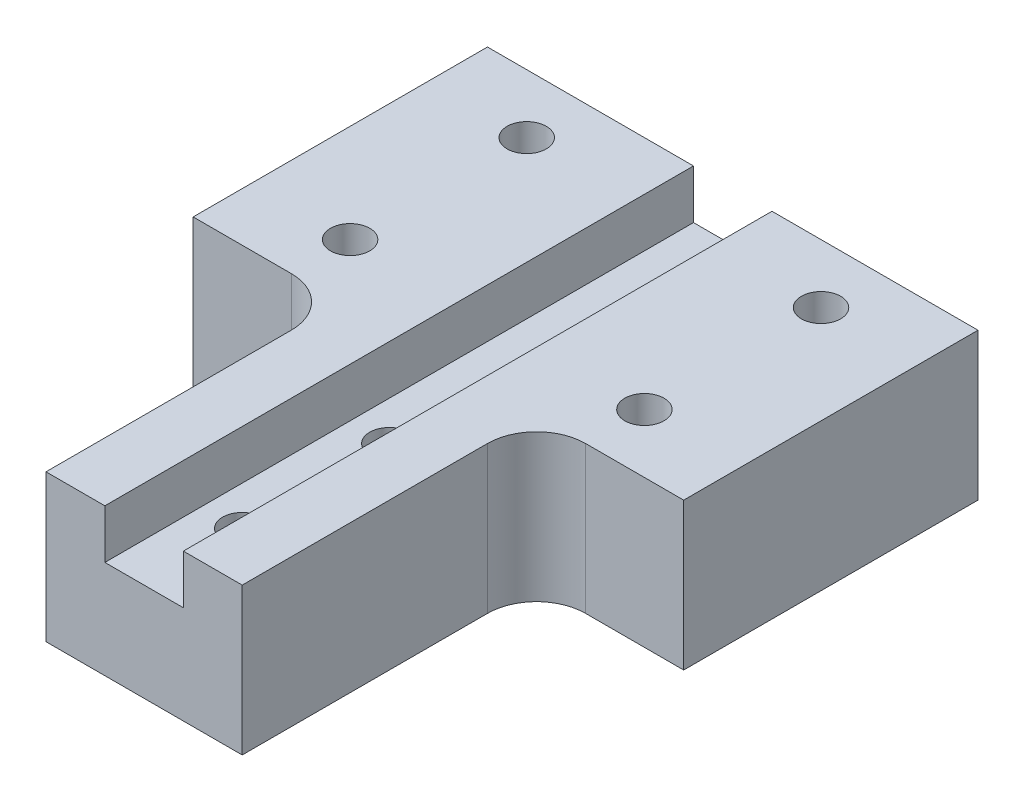
ISO-10303-21;
HEADER;
FILE_DESCRIPTION(('STEP AP214'),'2;1');
FILE_NAME('part.step','',(''),(''),'','','');
FILE_SCHEMA(('AUTOMOTIVE_DESIGN { 1 0 10303 214 1 1 1 1 }'));
ENDSEC;
DATA;
#1=APPLICATION_CONTEXT('core data for automotive mechanical design processes');
#2=APPLICATION_PROTOCOL_DEFINITION('international standard','automotive_design',2000,#1);
#3=PRODUCT_CONTEXT('',#1,'mechanical');
#4=PRODUCT('Part','Part','',(#3));
#5=PRODUCT_RELATED_PRODUCT_CATEGORY('part','',(#4));
#6=PRODUCT_DEFINITION_FORMATION('','',#4);
#7=PRODUCT_DEFINITION_CONTEXT('part definition',#1,'design');
#8=PRODUCT_DEFINITION('design','',#6,#7);
#9=PRODUCT_DEFINITION_SHAPE('','',#8);
#10=(LENGTH_UNIT() NAMED_UNIT(*) SI_UNIT(.MILLI.,.METRE.));
#11=(NAMED_UNIT(*) PLANE_ANGLE_UNIT() SI_UNIT($,.RADIAN.));
#12=(NAMED_UNIT(*) SI_UNIT($,.STERADIAN.) SOLID_ANGLE_UNIT());
#13=UNCERTAINTY_MEASURE_WITH_UNIT(LENGTH_MEASURE(1.E-05),#10,'distance_accuracy_value','');
#14=(GEOMETRIC_REPRESENTATION_CONTEXT(3) GLOBAL_UNCERTAINTY_ASSIGNED_CONTEXT((#13)) GLOBAL_UNIT_ASSIGNED_CONTEXT((#10,
#11,#12)) REPRESENTATION_CONTEXT('',''));
#15=CARTESIAN_POINT('',(0.,0.,0.));
#16=DIRECTION('',(0.,0.,1.));
#17=DIRECTION('',(1.,0.,0.));
#18=AXIS2_PLACEMENT_3D('',#15,#16,#17);
#19=CARTESIAN_POINT('',(0.,0.,0.));
#20=DIRECTION('',(0.,1.,0.));
#21=DIRECTION('',(0.,0.,1.));
#22=AXIS2_PLACEMENT_3D('',#19,#20,#21);
#23=PLANE('',#22);
#24=DIRECTION('',(0.,0.,-1.));
#25=VECTOR('',#24,1.);
#26=CARTESIAN_POINT('',(3.99999999999999,0.,-21.8624338624339));
#27=LINE('',#26,#25);
#28=CARTESIAN_POINT('',(4.00000000000001,0.,45.));
#29=VERTEX_POINT('',#28);
#30=CARTESIAN_POINT('',(4.,0.,-15.));
#31=VERTEX_POINT('',#30);
#32=EDGE_CURVE('E144',#29,#31,#27,.T.);
#33=ORIENTED_EDGE('',*,*,#32,.F.);
#34=DIRECTION('',(1.,0.,0.));
#35=VECTOR('',#34,1.);
#36=CARTESIAN_POINT('',(0.,0.,45.));
#37=LINE('',#36,#35);
#38=CARTESIAN_POINT('',(10.,0.,45.));
#39=VERTEX_POINT('',#38);
#40=EDGE_CURVE('E155',#29,#39,#37,.T.);
#41=ORIENTED_EDGE('',*,*,#40,.T.);
#42=DIRECTION('',(0.,0.,1.));
#43=VECTOR('',#42,1.);
#44=CARTESIAN_POINT('',(10.,0.,0.));
#45=LINE('',#44,#43);
#46=CARTESIAN_POINT('',(10.,0.,20.));
#47=VERTEX_POINT('',#46);
#48=EDGE_CURVE('E171',#47,#39,#45,.T.);
#49=ORIENTED_EDGE('',*,*,#48,.F.);
#50=CARTESIAN_POINT('',(15.,0.,20.));
#51=DIRECTION('',(0.,1.,0.));
#52=DIRECTION('',(0.,0.,1.));
#53=AXIS2_PLACEMENT_3D('',#50,#51,#52);
#54=CIRCLE('',#53,5.);
#55=CARTESIAN_POINT('',(15.,0.,15.));
#56=VERTEX_POINT('',#55);
#57=EDGE_CURVE('E248',#47,#56,#54,.F.);
#58=ORIENTED_EDGE('',*,*,#57,.T.);
#59=DIRECTION('',(1.,0.,0.));
#60=VECTOR('',#59,1.);
#61=CARTESIAN_POINT('',(0.,0.,15.));
#62=LINE('',#61,#60);
#63=CARTESIAN_POINT('',(25.,0.,15.));
#64=VERTEX_POINT('',#63);
#65=EDGE_CURVE('E227',#56,#64,#62,.T.);
#66=ORIENTED_EDGE('',*,*,#65,.T.);
#67=DIRECTION('',(0.,0.,1.));
#68=VECTOR('',#67,1.);
#69=CARTESIAN_POINT('',(25.,0.,0.));
#70=LINE('',#69,#68);
#71=CARTESIAN_POINT('',(25.,0.,-15.));
#72=VERTEX_POINT('',#71);
#73=EDGE_CURVE('E218',#72,#64,#70,.T.);
#74=ORIENTED_EDGE('',*,*,#73,.F.);
#75=DIRECTION('',(1.,0.,0.));
#76=VECTOR('',#75,1.);
#77=CARTESIAN_POINT('',(0.,0.,-15.));
#78=LINE('',#77,#76);
#79=EDGE_CURVE('E158',#31,#72,#78,.T.);
#80=ORIENTED_EDGE('',*,*,#79,.F.);
#81=EDGE_LOOP('',(#33,#41,#49,#58,#66,#74,#80));
#82=FACE_BOUND('',#81,.T.);
#83=CARTESIAN_POINT('',(15.,0.,9.));
#84=DIRECTION('',(0.,1.,0.));
#85=DIRECTION('',(0.,0.,1.));
#86=AXIS2_PLACEMENT_3D('',#83,#84,#85);
#87=CIRCLE('',#86,2.00000000000001);
#88=CARTESIAN_POINT('',(15.,0.,11.));
#89=VERTEX_POINT('',#88);
#90=EDGE_CURVE('E212',#89,#89,#87,.T.);
#91=ORIENTED_EDGE('',*,*,#90,.F.);
#92=EDGE_LOOP('',(#91));
#93=FACE_BOUND('',#92,.T.);
#94=CARTESIAN_POINT('',(15.,0.,-9.));
#95=DIRECTION('',(0.,1.,0.));
#96=DIRECTION('',(0.,0.,1.));
#97=AXIS2_PLACEMENT_3D('',#94,#95,#96);
#98=CIRCLE('',#97,2.00000000000001);
#99=CARTESIAN_POINT('',(15.,0.,-6.99999999999999));
#100=VERTEX_POINT('',#99);
#101=EDGE_CURVE('E205',#100,#100,#98,.T.);
#102=ORIENTED_EDGE('',*,*,#101,.F.);
#103=EDGE_LOOP('',(#102));
#104=FACE_BOUND('',#103,.T.);
#105=ADVANCED_FACE('F42',(#82,#93,#104),#23,.T.);
#106=CARTESIAN_POINT('',(0.,-51.0555127546399,20.));
#107=DIRECTION('',(0.,1.,0.));
#108=DIRECTION('',(0.,0.,1.));
#109=AXIS2_PLACEMENT_3D('',#106,#107,#108);
#110=CYLINDRICAL_SURFACE('',#109,2.);
#111=CARTESIAN_POINT('',(0.,-15.,20.));
#112=DIRECTION('',(0.,1.,0.));
#113=DIRECTION('',(0.,0.,1.));
#114=AXIS2_PLACEMENT_3D('',#111,#112,#113);
#115=CIRCLE('',#114,2.);
#116=CARTESIAN_POINT('',(0.,-15.,22.));
#117=VERTEX_POINT('',#116);
#118=EDGE_CURVE('E209',#117,#117,#115,.F.);
#119=CARTESIAN_POINT('',(0.,-5.,20.));
#120=DIRECTION('',(0.,1.,0.));
#121=DIRECTION('',(0.,0.,1.));
#122=AXIS2_PLACEMENT_3D('',#119,#120,#121);
#123=CIRCLE('',#122,2.);
#124=CARTESIAN_POINT('',(0.,-5.,22.));
#125=VERTEX_POINT('',#124);
#126=EDGE_CURVE('E270',#125,#125,#123,.F.);
#127=CARTESIAN_POINT('',(0.,-15.,22.));
#128=CARTESIAN_POINT('',(0.,-14.8958333333333,22.));
#129=CARTESIAN_POINT('',(0.,-14.7916666666667,22.));
#130=CARTESIAN_POINT('',(0.,-14.5833333333333,22.));
#131=CARTESIAN_POINT('',(0.,-14.4791666666667,22.));
#132=CARTESIAN_POINT('',(0.,-14.2708333333333,22.));
#133=CARTESIAN_POINT('',(0.,-14.1666666666667,22.));
#134=CARTESIAN_POINT('',(0.,-13.9583333333333,22.));
#135=CARTESIAN_POINT('',(0.,-13.8541666666667,22.));
#136=CARTESIAN_POINT('',(0.,-13.6458333333333,22.));
#137=CARTESIAN_POINT('',(0.,-13.5416666666667,22.));
#138=CARTESIAN_POINT('',(0.,-13.3333333333333,22.));
#139=CARTESIAN_POINT('',(0.,-13.2291666666667,22.));
#140=CARTESIAN_POINT('',(0.,-13.0208333333333,22.));
#141=CARTESIAN_POINT('',(0.,-12.9166666666667,22.));
#142=CARTESIAN_POINT('',(0.,-12.7083333333333,22.));
#143=CARTESIAN_POINT('',(0.,-12.6041666666667,22.));
#144=CARTESIAN_POINT('',(0.,-12.3958333333333,22.));
#145=CARTESIAN_POINT('',(0.,-12.2916666666667,22.));
#146=CARTESIAN_POINT('',(0.,-12.0833333333333,22.));
#147=CARTESIAN_POINT('',(0.,-11.9791666666667,22.));
#148=CARTESIAN_POINT('',(0.,-11.7708333333333,22.));
#149=CARTESIAN_POINT('',(0.,-11.6666666666667,22.));
#150=CARTESIAN_POINT('',(0.,-11.4583333333333,22.));
#151=CARTESIAN_POINT('',(0.,-11.3541666666667,22.));
#152=CARTESIAN_POINT('',(0.,-11.1458333333333,22.));
#153=CARTESIAN_POINT('',(0.,-11.0416666666667,22.));
#154=CARTESIAN_POINT('',(0.,-10.8333333333333,22.));
#155=CARTESIAN_POINT('',(0.,-10.7291666666667,22.));
#156=CARTESIAN_POINT('',(0.,-10.5208333333333,22.));
#157=CARTESIAN_POINT('',(0.,-10.4166666666667,22.));
#158=CARTESIAN_POINT('',(0.,-10.2083333333333,22.));
#159=CARTESIAN_POINT('',(0.,-10.1041666666667,22.));
#160=CARTESIAN_POINT('',(0.,-9.89583333333333,22.));
#161=CARTESIAN_POINT('',(0.,-9.79166666666667,22.));
#162=CARTESIAN_POINT('',(0.,-9.58333333333333,22.));
#163=CARTESIAN_POINT('',(0.,-9.47916666666667,22.));
#164=CARTESIAN_POINT('',(0.,-9.27083333333333,22.));
#165=CARTESIAN_POINT('',(0.,-9.16666666666667,22.));
#166=CARTESIAN_POINT('',(0.,-8.95833333333333,22.));
#167=CARTESIAN_POINT('',(0.,-8.85416666666667,22.));
#168=CARTESIAN_POINT('',(0.,-8.64583333333333,22.));
#169=CARTESIAN_POINT('',(0.,-8.54166666666667,22.));
#170=CARTESIAN_POINT('',(0.,-8.33333333333333,22.));
#171=CARTESIAN_POINT('',(0.,-8.22916666666667,22.));
#172=CARTESIAN_POINT('',(0.,-8.02083333333333,22.));
#173=CARTESIAN_POINT('',(0.,-7.91666666666667,22.));
#174=CARTESIAN_POINT('',(0.,-7.70833333333333,22.));
#175=CARTESIAN_POINT('',(0.,-7.60416666666667,22.));
#176=CARTESIAN_POINT('',(0.,-7.39583333333333,22.));
#177=CARTESIAN_POINT('',(0.,-7.29166666666667,22.));
#178=CARTESIAN_POINT('',(0.,-7.08333333333333,22.));
#179=CARTESIAN_POINT('',(0.,-6.97916666666667,22.));
#180=CARTESIAN_POINT('',(0.,-6.77083333333333,22.));
#181=CARTESIAN_POINT('',(0.,-6.66666666666667,22.));
#182=CARTESIAN_POINT('',(0.,-6.45833333333333,22.));
#183=CARTESIAN_POINT('',(0.,-6.35416666666667,22.));
#184=CARTESIAN_POINT('',(0.,-6.14583333333333,22.));
#185=CARTESIAN_POINT('',(0.,-6.04166666666667,22.));
#186=CARTESIAN_POINT('',(0.,-5.83333333333333,22.));
#187=CARTESIAN_POINT('',(0.,-5.72916666666666,22.));
#188=CARTESIAN_POINT('',(0.,-5.52083333333333,22.));
#189=CARTESIAN_POINT('',(0.,-5.41666666666666,22.));
#190=CARTESIAN_POINT('',(0.,-5.20833333333333,22.));
#191=CARTESIAN_POINT('',(0.,-5.10416666666666,22.));
#192=CARTESIAN_POINT('',(0.,-5.,22.));
#193=B_SPLINE_CURVE_WITH_KNOTS('',3,(#127,#128,#129,#130,#131,#132,#133,#134,#135,#136,#137,
#138,#139,#140,#141,#142,#143,#144,#145,#146,#147,#148,#149,#150,#151,#152,#153,#154,#155,#156,
#157,#158,#159,#160,#161,#162,#163,#164,#165,#166,#167,#168,#169,#170,#171,#172,#173,#174,#175,
#176,#177,#178,#179,#180,#181,#182,#183,#184,#185,#186,#187,#188,#189,#190,#191,#192),
.UNSPECIFIED.,.F.,.F.,(4,2,2,2,2,2,2,2,2,2,2,2,2,2,2,2,2,2,2,2,2,2,2,2,2,2,2,2,2,2,2,2,4),(0.,
0.3125,0.625000000000001,0.937500000000001,1.25,1.5625,1.875,2.1875,2.5,2.8125,3.125,3.4375,
3.75,4.0625,4.375,4.6875,5.,5.3125,5.62500000000001,5.93750000000001,6.25000000000001,
6.56250000000001,6.87500000000001,7.18750000000001,7.50000000000001,7.81250000000001,
8.12500000000001,8.43750000000001,8.75000000000001,9.06250000000001,9.37500000000001,
9.68750000000001,10.),.UNSPECIFIED.);
#194=EDGE_CURVE('BSEAM337',#117,#125,#193,.T.);
#195=ORIENTED_EDGE('',*,*,#118,.T.);
#196=ORIENTED_EDGE('',*,*,#126,.F.);
#197=ORIENTED_EDGE('',*,*,#194,.T.);
#198=ORIENTED_EDGE('',*,*,#194,.F.);
#199=EDGE_LOOP('',(#195,#197,#196,#198));
#200=FACE_BOUND('',#199,.T.);
#201=ADVANCED_FACE('F337',(#200),#110,.F.);
#202=CARTESIAN_POINT('',(0.,-51.0555127546399,35.));
#203=DIRECTION('',(0.,1.,0.));
#204=DIRECTION('',(0.,0.,1.));
#205=AXIS2_PLACEMENT_3D('',#202,#203,#204);
#206=CYLINDRICAL_SURFACE('',#205,2.);
#207=CARTESIAN_POINT('',(0.,-15.,35.));
#208=DIRECTION('',(0.,1.,0.));
#209=DIRECTION('',(0.,0.,1.));
#210=AXIS2_PLACEMENT_3D('',#207,#208,#209);
#211=CIRCLE('',#210,2.);
#212=CARTESIAN_POINT('',(0.,-15.,37.));
#213=VERTEX_POINT('',#212);
#214=EDGE_CURVE('E286',#213,#213,#211,.F.);
#215=CARTESIAN_POINT('',(0.,-5.,35.));
#216=DIRECTION('',(0.,1.,0.));
#217=DIRECTION('',(0.,0.,1.));
#218=AXIS2_PLACEMENT_3D('',#215,#216,#217);
#219=CIRCLE('',#218,2.);
#220=CARTESIAN_POINT('',(0.,-5.,37.));
#221=VERTEX_POINT('',#220);
#222=EDGE_CURVE('E274',#221,#221,#219,.F.);
#223=CARTESIAN_POINT('',(0.,-15.,37.));
#224=CARTESIAN_POINT('',(0.,-14.8958333333333,37.));
#225=CARTESIAN_POINT('',(0.,-14.7916666666667,37.));
#226=CARTESIAN_POINT('',(0.,-14.5833333333333,37.));
#227=CARTESIAN_POINT('',(0.,-14.4791666666667,37.));
#228=CARTESIAN_POINT('',(0.,-14.2708333333333,37.));
#229=CARTESIAN_POINT('',(0.,-14.1666666666667,37.));
#230=CARTESIAN_POINT('',(0.,-13.9583333333333,37.));
#231=CARTESIAN_POINT('',(0.,-13.8541666666667,37.));
#232=CARTESIAN_POINT('',(0.,-13.6458333333333,37.));
#233=CARTESIAN_POINT('',(0.,-13.5416666666667,37.));
#234=CARTESIAN_POINT('',(0.,-13.3333333333333,37.));
#235=CARTESIAN_POINT('',(0.,-13.2291666666667,37.));
#236=CARTESIAN_POINT('',(0.,-13.0208333333333,37.));
#237=CARTESIAN_POINT('',(0.,-12.9166666666667,37.));
#238=CARTESIAN_POINT('',(0.,-12.7083333333333,37.));
#239=CARTESIAN_POINT('',(0.,-12.6041666666667,37.));
#240=CARTESIAN_POINT('',(0.,-12.3958333333333,37.));
#241=CARTESIAN_POINT('',(0.,-12.2916666666667,37.));
#242=CARTESIAN_POINT('',(0.,-12.0833333333333,37.));
#243=CARTESIAN_POINT('',(0.,-11.9791666666667,37.));
#244=CARTESIAN_POINT('',(0.,-11.7708333333333,37.));
#245=CARTESIAN_POINT('',(0.,-11.6666666666667,37.));
#246=CARTESIAN_POINT('',(0.,-11.4583333333333,37.));
#247=CARTESIAN_POINT('',(0.,-11.3541666666667,37.));
#248=CARTESIAN_POINT('',(0.,-11.1458333333333,37.));
#249=CARTESIAN_POINT('',(0.,-11.0416666666667,37.));
#250=CARTESIAN_POINT('',(0.,-10.8333333333333,37.));
#251=CARTESIAN_POINT('',(0.,-10.7291666666667,37.));
#252=CARTESIAN_POINT('',(0.,-10.5208333333333,37.));
#253=CARTESIAN_POINT('',(0.,-10.4166666666667,37.));
#254=CARTESIAN_POINT('',(0.,-10.2083333333333,37.));
#255=CARTESIAN_POINT('',(0.,-10.1041666666667,37.));
#256=CARTESIAN_POINT('',(0.,-9.89583333333333,37.));
#257=CARTESIAN_POINT('',(0.,-9.79166666666667,37.));
#258=CARTESIAN_POINT('',(0.,-9.58333333333333,37.));
#259=CARTESIAN_POINT('',(0.,-9.47916666666667,37.));
#260=CARTESIAN_POINT('',(0.,-9.27083333333333,37.));
#261=CARTESIAN_POINT('',(0.,-9.16666666666667,37.));
#262=CARTESIAN_POINT('',(0.,-8.95833333333333,37.));
#263=CARTESIAN_POINT('',(0.,-8.85416666666667,37.));
#264=CARTESIAN_POINT('',(0.,-8.64583333333333,37.));
#265=CARTESIAN_POINT('',(0.,-8.54166666666667,37.));
#266=CARTESIAN_POINT('',(0.,-8.33333333333333,37.));
#267=CARTESIAN_POINT('',(0.,-8.22916666666667,37.));
#268=CARTESIAN_POINT('',(0.,-8.02083333333333,37.));
#269=CARTESIAN_POINT('',(0.,-7.91666666666667,37.));
#270=CARTESIAN_POINT('',(0.,-7.70833333333333,37.));
#271=CARTESIAN_POINT('',(0.,-7.60416666666667,37.));
#272=CARTESIAN_POINT('',(0.,-7.39583333333333,37.));
#273=CARTESIAN_POINT('',(0.,-7.29166666666667,37.));
#274=CARTESIAN_POINT('',(0.,-7.08333333333333,37.));
#275=CARTESIAN_POINT('',(0.,-6.97916666666667,37.));
#276=CARTESIAN_POINT('',(0.,-6.77083333333333,37.));
#277=CARTESIAN_POINT('',(0.,-6.66666666666667,37.));
#278=CARTESIAN_POINT('',(0.,-6.45833333333333,37.));
#279=CARTESIAN_POINT('',(0.,-6.35416666666667,37.));
#280=CARTESIAN_POINT('',(0.,-6.14583333333333,37.));
#281=CARTESIAN_POINT('',(0.,-6.04166666666667,37.));
#282=CARTESIAN_POINT('',(0.,-5.83333333333333,37.));
#283=CARTESIAN_POINT('',(0.,-5.72916666666666,37.));
#284=CARTESIAN_POINT('',(0.,-5.52083333333333,37.));
#285=CARTESIAN_POINT('',(0.,-5.41666666666666,37.));
#286=CARTESIAN_POINT('',(0.,-5.20833333333333,37.));
#287=CARTESIAN_POINT('',(0.,-5.10416666666666,37.));
#288=CARTESIAN_POINT('',(0.,-5.,37.));
#289=B_SPLINE_CURVE_WITH_KNOTS('',3,(#223,#224,#225,#226,#227,#228,#229,#230,#231,#232,#233,
#234,#235,#236,#237,#238,#239,#240,#241,#242,#243,#244,#245,#246,#247,#248,#249,#250,#251,#252,
#253,#254,#255,#256,#257,#258,#259,#260,#261,#262,#263,#264,#265,#266,#267,#268,#269,#270,#271,
#272,#273,#274,#275,#276,#277,#278,#279,#280,#281,#282,#283,#284,#285,#286,#287,#288),
.UNSPECIFIED.,.F.,.F.,(4,2,2,2,2,2,2,2,2,2,2,2,2,2,2,2,2,2,2,2,2,2,2,2,2,2,2,2,2,2,2,2,4),(0.,
0.3125,0.625000000000001,0.937500000000001,1.25,1.5625,1.875,2.1875,2.5,2.8125,3.125,3.4375,
3.75,4.0625,4.375,4.6875,5.,5.3125,5.62500000000001,5.93750000000001,6.25000000000001,
6.56250000000001,6.87500000000001,7.18750000000001,7.50000000000001,7.81250000000001,
8.12500000000001,8.43750000000001,8.75000000000001,9.06250000000001,9.37500000000001,
9.68750000000001,10.),.UNSPECIFIED.);
#290=EDGE_CURVE('BSEAM335',#213,#221,#289,.T.);
#291=ORIENTED_EDGE('',*,*,#214,.T.);
#292=ORIENTED_EDGE('',*,*,#222,.F.);
#293=ORIENTED_EDGE('',*,*,#290,.T.);
#294=ORIENTED_EDGE('',*,*,#290,.F.);
#295=EDGE_LOOP('',(#291,#293,#292,#294));
#296=FACE_BOUND('',#295,.T.);
#297=ADVANCED_FACE('F335',(#296),#206,.F.);
#298=CARTESIAN_POINT('',(0.,-15.,15.));
#299=DIRECTION('',(0.,0.,1.));
#300=DIRECTION('',(1.,0.,0.));
#301=AXIS2_PLACEMENT_3D('',#298,#299,#300);
#302=PLANE('',#301);
#303=DIRECTION('',(1.,0.,0.));
#304=VECTOR('',#303,1.);
#305=CARTESIAN_POINT('',(0.,-15.,15.));
#306=LINE('',#305,#304);
#307=CARTESIAN_POINT('',(-25.,-15.,15.));
#308=VERTEX_POINT('',#307);
#309=CARTESIAN_POINT('',(-15.,-15.,15.));
#310=VERTEX_POINT('',#309);
#311=EDGE_CURVE('E201',#308,#310,#306,.T.);
#312=ORIENTED_EDGE('',*,*,#311,.T.);
#313=DIRECTION('',(0.,1.,0.));
#314=VECTOR('',#313,1.);
#315=CARTESIAN_POINT('',(-15.,0.,15.));
#316=LINE('',#315,#314);
#317=CARTESIAN_POINT('',(-15.,0.,15.));
#318=VERTEX_POINT('',#317);
#319=EDGE_CURVE('E243',#310,#318,#316,.T.);
#320=ORIENTED_EDGE('',*,*,#319,.T.);
#321=CARTESIAN_POINT('',(-25.,0.,15.));
#322=VERTEX_POINT('',#321);
#323=EDGE_CURVE('E183',#322,#318,#62,.T.);
#324=ORIENTED_EDGE('',*,*,#323,.F.);
#325=DIRECTION('',(0.,1.,0.));
#326=VECTOR('',#325,1.);
#327=CARTESIAN_POINT('',(-25.,-15.,15.));
#328=LINE('',#327,#326);
#329=EDGE_CURVE('E233',#308,#322,#328,.T.);
#330=ORIENTED_EDGE('',*,*,#329,.F.);
#331=EDGE_LOOP('',(#312,#320,#324,#330));
#332=FACE_BOUND('',#331,.T.);
#333=ADVANCED_FACE('F320',(#332),#302,.T.);
#334=CARTESIAN_POINT('',(25.,-15.,0.));
#335=DIRECTION('',(-1.,0.,0.));
#336=DIRECTION('',(0.,0.,1.));
#337=AXIS2_PLACEMENT_3D('',#334,#335,#336);
#338=PLANE('',#337);
#339=ORIENTED_EDGE('',*,*,#73,.T.);
#340=DIRECTION('',(0.,1.,0.));
#341=VECTOR('',#340,1.);
#342=CARTESIAN_POINT('',(25.,-15.,15.));
#343=LINE('',#342,#341);
#344=CARTESIAN_POINT('',(25.,-15.,15.));
#345=VERTEX_POINT('',#344);
#346=EDGE_CURVE('E229',#345,#64,#343,.T.);
#347=ORIENTED_EDGE('',*,*,#346,.F.);
#348=DIRECTION('',(0.,0.,1.));
#349=VECTOR('',#348,1.);
#350=CARTESIAN_POINT('',(25.,-15.,0.));
#351=LINE('',#350,#349);
#352=CARTESIAN_POINT('',(25.,-15.,-15.));
#353=VERTEX_POINT('',#352);
#354=EDGE_CURVE('E192',#353,#345,#351,.T.);
#355=ORIENTED_EDGE('',*,*,#354,.F.);
#356=DIRECTION('',(0.,1.,0.));
#357=VECTOR('',#356,1.);
#358=CARTESIAN_POINT('',(25.,-15.,-15.));
#359=LINE('',#358,#357);
#360=EDGE_CURVE('E204',#353,#72,#359,.T.);
#361=ORIENTED_EDGE('',*,*,#360,.T.);
#362=EDGE_LOOP('',(#339,#347,#355,#361));
#363=FACE_BOUND('',#362,.T.);
#364=ADVANCED_FACE('F310',(#363),#338,.F.);
#365=ORIENTED_EDGE('',*,*,#65,.F.);
#366=DIRECTION('',(0.,1.,0.));
#367=VECTOR('',#366,1.);
#368=CARTESIAN_POINT('',(15.,-15.,15.));
#369=LINE('',#368,#367);
#370=CARTESIAN_POINT('',(15.,-15.,15.));
#371=VERTEX_POINT('',#370);
#372=EDGE_CURVE('E241',#56,#371,#369,.F.);
#373=ORIENTED_EDGE('',*,*,#372,.T.);
#374=EDGE_CURVE('E200',#371,#345,#306,.T.);
#375=ORIENTED_EDGE('',*,*,#374,.T.);
#376=ORIENTED_EDGE('',*,*,#346,.T.);
#377=EDGE_LOOP('',(#365,#373,#375,#376));
#378=FACE_BOUND('',#377,.T.);
#379=ADVANCED_FACE('F297',(#378),#302,.T.);
#380=CARTESIAN_POINT('',(-25.,-15.,0.));
#381=DIRECTION('',(-1.,0.,0.));
#382=DIRECTION('',(0.,0.,1.));
#383=AXIS2_PLACEMENT_3D('',#380,#381,#382);
#384=PLANE('',#383);
#385=DIRECTION('',(0.,0.,1.));
#386=VECTOR('',#385,1.);
#387=CARTESIAN_POINT('',(-25.,0.,0.));
#388=LINE('',#387,#386);
#389=CARTESIAN_POINT('',(-25.,0.,-15.));
#390=VERTEX_POINT('',#389);
#391=EDGE_CURVE('E224',#390,#322,#388,.T.);
#392=ORIENTED_EDGE('',*,*,#391,.F.);
#393=DIRECTION('',(0.,1.,0.));
#394=VECTOR('',#393,1.);
#395=CARTESIAN_POINT('',(-25.,-15.,-15.));
#396=LINE('',#395,#394);
#397=CARTESIAN_POINT('',(-25.,-15.,-15.));
#398=VERTEX_POINT('',#397);
#399=EDGE_CURVE('E235',#398,#390,#396,.T.);
#400=ORIENTED_EDGE('',*,*,#399,.F.);
#401=DIRECTION('',(0.,0.,1.));
#402=VECTOR('',#401,1.);
#403=CARTESIAN_POINT('',(-25.,-15.,0.));
#404=LINE('',#403,#402);
#405=EDGE_CURVE('E197',#398,#308,#404,.T.);
#406=ORIENTED_EDGE('',*,*,#405,.T.);
#407=ORIENTED_EDGE('',*,*,#329,.T.);
#408=EDGE_LOOP('',(#392,#400,#406,#407));
#409=FACE_BOUND('',#408,.T.);
#410=ADVANCED_FACE('F315',(#409),#384,.T.);
#411=CARTESIAN_POINT('',(-15.,-15.,-9.));
#412=DIRECTION('',(0.,1.,0.));
#413=DIRECTION('',(0.,0.,1.));
#414=AXIS2_PLACEMENT_3D('',#411,#412,#413);
#415=CYLINDRICAL_SURFACE('',#414,2.);
#416=CARTESIAN_POINT('',(-15.,-15.,-9.));
#417=DIRECTION('',(0.,1.,0.));
#418=DIRECTION('',(0.,0.,1.));
#419=AXIS2_PLACEMENT_3D('',#416,#417,#418);
#420=CIRCLE('',#419,2.);
#421=CARTESIAN_POINT('',(-15.,-15.,-7.));
#422=VERTEX_POINT('',#421);
#423=EDGE_CURVE('E189',#422,#422,#420,.T.);
#424=ORIENTED_EDGE('',*,*,#423,.F.);
#425=EDGE_LOOP('',(#424));
#426=FACE_BOUND('',#425,.T.);
#427=CARTESIAN_POINT('',(-15.,0.,-9.));
#428=DIRECTION('',(0.,1.,0.));
#429=DIRECTION('',(0.,0.,1.));
#430=AXIS2_PLACEMENT_3D('',#427,#428,#429);
#431=CIRCLE('',#430,2.);
#432=CARTESIAN_POINT('',(-15.,0.,-7.));
#433=VERTEX_POINT('',#432);
#434=EDGE_CURVE('E215',#433,#433,#431,.T.);
#435=ORIENTED_EDGE('',*,*,#434,.T.);
#436=EDGE_LOOP('',(#435));
#437=FACE_BOUND('',#436,.T.);
#438=ADVANCED_FACE('F372',(#426,#437),#415,.F.);
#439=CARTESIAN_POINT('',(15.,-15.,9.));
#440=DIRECTION('',(0.,1.,0.));
#441=DIRECTION('',(0.,0.,1.));
#442=AXIS2_PLACEMENT_3D('',#439,#440,#441);
#443=CYLINDRICAL_SURFACE('',#442,2.00000000000001);
#444=CARTESIAN_POINT('',(15.,-15.,9.));
#445=DIRECTION('',(0.,1.,0.));
#446=DIRECTION('',(0.,0.,1.));
#447=AXIS2_PLACEMENT_3D('',#444,#445,#446);
#448=CIRCLE('',#447,2.00000000000001);
#449=CARTESIAN_POINT('',(15.,-15.,11.));
#450=VERTEX_POINT('',#449);
#451=EDGE_CURVE('E186',#450,#450,#448,.T.);
#452=ORIENTED_EDGE('',*,*,#451,.F.);
#453=EDGE_LOOP('',(#452));
#454=FACE_BOUND('',#453,.T.);
#455=ORIENTED_EDGE('',*,*,#90,.T.);
#456=EDGE_LOOP('',(#455));
#457=FACE_BOUND('',#456,.T.);
#458=ADVANCED_FACE('F375',(#454,#457),#443,.F.);
#459=CARTESIAN_POINT('',(-15.,-15.,9.));
#460=DIRECTION('',(0.,1.,0.));
#461=DIRECTION('',(0.,0.,1.));
#462=AXIS2_PLACEMENT_3D('',#459,#460,#461);
#463=CYLINDRICAL_SURFACE('',#462,2.);
#464=CARTESIAN_POINT('',(-15.,-15.,9.));
#465=DIRECTION('',(0.,1.,0.));
#466=DIRECTION('',(0.,0.,1.));
#467=AXIS2_PLACEMENT_3D('',#464,#465,#466);
#468=CIRCLE('',#467,2.);
#469=CARTESIAN_POINT('',(-15.,-15.,11.));
#470=VERTEX_POINT('',#469);
#471=EDGE_CURVE('E182',#470,#470,#468,.T.);
#472=ORIENTED_EDGE('',*,*,#471,.F.);
#473=EDGE_LOOP('',(#472));
#474=FACE_BOUND('',#473,.T.);
#475=CARTESIAN_POINT('',(-15.,0.,9.));
#476=DIRECTION('',(0.,1.,0.));
#477=DIRECTION('',(0.,0.,1.));
#478=AXIS2_PLACEMENT_3D('',#475,#476,#477);
#479=CIRCLE('',#478,2.);
#480=CARTESIAN_POINT('',(-15.,0.,11.));
#481=VERTEX_POINT('',#480);
#482=EDGE_CURVE('E208',#481,#481,#479,.T.);
#483=ORIENTED_EDGE('',*,*,#482,.T.);
#484=EDGE_LOOP('',(#483));
#485=FACE_BOUND('',#484,.T.);
#486=ADVANCED_FACE('F383',(#474,#485),#463,.F.);
#487=CARTESIAN_POINT('',(15.,-15.,-9.));
#488=DIRECTION('',(0.,1.,0.));
#489=DIRECTION('',(0.,0.,1.));
#490=AXIS2_PLACEMENT_3D('',#487,#488,#489);
#491=CYLINDRICAL_SURFACE('',#490,2.00000000000001);
#492=CARTESIAN_POINT('',(15.,-15.,-9.));
#493=DIRECTION('',(0.,1.,0.));
#494=DIRECTION('',(0.,0.,1.));
#495=AXIS2_PLACEMENT_3D('',#492,#493,#494);
#496=CIRCLE('',#495,2.00000000000001);
#497=CARTESIAN_POINT('',(15.,-15.,-6.99999999999999));
#498=VERTEX_POINT('',#497);
#499=EDGE_CURVE('E179',#498,#498,#496,.T.);
#500=ORIENTED_EDGE('',*,*,#499,.F.);
#501=EDGE_LOOP('',(#500));
#502=FACE_BOUND('',#501,.T.);
#503=ORIENTED_EDGE('',*,*,#101,.T.);
#504=EDGE_LOOP('',(#503));
#505=FACE_BOUND('',#504,.T.);
#506=ADVANCED_FACE('F362',(#502,#505),#491,.F.);
#507=CARTESIAN_POINT('',(0.,-15.,-15.));
#508=DIRECTION('',(0.,0.,1.));
#509=DIRECTION('',(1.,0.,0.));
#510=AXIS2_PLACEMENT_3D('',#507,#508,#509);
#511=PLANE('',#510);
#512=DIRECTION('',(-1.,0.,0.));
#513=VECTOR('',#512,1.);
#514=CARTESIAN_POINT('',(0.,-5.,-15.));
#515=LINE('',#514,#513);
#516=CARTESIAN_POINT('',(4.,-5.,-15.));
#517=VERTEX_POINT('',#516);
#518=CARTESIAN_POINT('',(-4.00000000000001,-5.,-15.));
#519=VERTEX_POINT('',#518);
#520=EDGE_CURVE('E264',#517,#519,#515,.T.);
#521=ORIENTED_EDGE('',*,*,#520,.F.);
#522=DIRECTION('',(0.,1.,0.));
#523=VECTOR('',#522,1.);
#524=CARTESIAN_POINT('',(4.,-15.,-15.));
#525=LINE('',#524,#523);
#526=EDGE_CURVE('E268',#517,#31,#525,.T.);
#527=ORIENTED_EDGE('',*,*,#526,.T.);
#528=ORIENTED_EDGE('',*,*,#79,.T.);
#529=ORIENTED_EDGE('',*,*,#360,.F.);
#530=DIRECTION('',(1.,0.,0.));
#531=VECTOR('',#530,1.);
#532=CARTESIAN_POINT('',(0.,-15.,-15.));
#533=LINE('',#532,#531);
#534=EDGE_CURVE('E195',#398,#353,#533,.T.);
#535=ORIENTED_EDGE('',*,*,#534,.F.);
#536=ORIENTED_EDGE('',*,*,#399,.T.);
#537=CARTESIAN_POINT('',(-4.00000000000001,0.,-15.));
#538=VERTEX_POINT('',#537);
#539=EDGE_CURVE('E221',#390,#538,#78,.T.);
#540=ORIENTED_EDGE('',*,*,#539,.T.);
#541=DIRECTION('',(0.,-1.,0.));
#542=VECTOR('',#541,1.);
#543=CARTESIAN_POINT('',(-4.00000000000001,-15.,-15.));
#544=LINE('',#543,#542);
#545=EDGE_CURVE('E269',#538,#519,#544,.T.);
#546=ORIENTED_EDGE('',*,*,#545,.T.);
#547=EDGE_LOOP('',(#521,#527,#528,#529,#535,#536,#540,#546));
#548=FACE_BOUND('',#547,.T.);
#549=ADVANCED_FACE('F267',(#548),#511,.F.);
#550=CARTESIAN_POINT('',(0.,-15.,0.));
#551=DIRECTION('',(0.,1.,0.));
#552=DIRECTION('',(0.,0.,1.));
#553=AXIS2_PLACEMENT_3D('',#550,#551,#552);
#554=PLANE('',#553);
#555=ORIENTED_EDGE('',*,*,#499,.T.);
#556=EDGE_LOOP('',(#555));
#557=FACE_BOUND('',#556,.T.);
#558=ORIENTED_EDGE('',*,*,#471,.T.);
#559=EDGE_LOOP('',(#558));
#560=FACE_BOUND('',#559,.T.);
#561=ORIENTED_EDGE('',*,*,#451,.T.);
#562=EDGE_LOOP('',(#561));
#563=FACE_BOUND('',#562,.T.);
#564=ORIENTED_EDGE('',*,*,#423,.T.);
#565=EDGE_LOOP('',(#564));
#566=FACE_BOUND('',#565,.T.);
#567=ORIENTED_EDGE('',*,*,#354,.T.);
#568=ORIENTED_EDGE('',*,*,#374,.F.);
#569=CARTESIAN_POINT('',(15.,-15.,20.));
#570=DIRECTION('',(0.,1.,0.));
#571=DIRECTION('',(0.,0.,1.));
#572=AXIS2_PLACEMENT_3D('',#569,#570,#571);
#573=CIRCLE('',#572,5.);
#574=CARTESIAN_POINT('',(10.,-15.,20.));
#575=VERTEX_POINT('',#574);
#576=EDGE_CURVE('E250',#371,#575,#573,.T.);
#577=ORIENTED_EDGE('',*,*,#576,.T.);
#578=DIRECTION('',(0.,0.,-1.));
#579=VECTOR('',#578,1.);
#580=CARTESIAN_POINT('',(10.,-15.,0.));
#581=LINE('',#580,#579);
#582=CARTESIAN_POINT('',(10.,-15.,45.));
#583=VERTEX_POINT('',#582);
#584=EDGE_CURVE('E283',#583,#575,#581,.T.);
#585=ORIENTED_EDGE('',*,*,#584,.F.);
#586=DIRECTION('',(-1.,0.,0.));
#587=VECTOR('',#586,1.);
#588=CARTESIAN_POINT('',(0.,-15.,45.));
#589=LINE('',#588,#587);
#590=CARTESIAN_POINT('',(-10.,-15.,45.));
#591=VERTEX_POINT('',#590);
#592=EDGE_CURVE('E281',#583,#591,#589,.T.);
#593=ORIENTED_EDGE('',*,*,#592,.T.);
#594=DIRECTION('',(0.,0.,-1.));
#595=VECTOR('',#594,1.);
#596=CARTESIAN_POINT('',(-10.,-15.,0.));
#597=LINE('',#596,#595);
#598=CARTESIAN_POINT('',(-10.,-15.,20.));
#599=VERTEX_POINT('',#598);
#600=EDGE_CURVE('E176',#591,#599,#597,.T.);
#601=ORIENTED_EDGE('',*,*,#600,.T.);
#602=CARTESIAN_POINT('',(-15.,-15.,20.));
#603=DIRECTION('',(0.,1.,0.));
#604=DIRECTION('',(0.,0.,1.));
#605=AXIS2_PLACEMENT_3D('',#602,#603,#604);
#606=CIRCLE('',#605,5.);
#607=EDGE_CURVE('E253',#599,#310,#606,.T.);
#608=ORIENTED_EDGE('',*,*,#607,.T.);
#609=ORIENTED_EDGE('',*,*,#311,.F.);
#610=ORIENTED_EDGE('',*,*,#405,.F.);
#611=ORIENTED_EDGE('',*,*,#534,.T.);
#612=EDGE_LOOP('',(#567,#568,#577,#585,#593,#601,#608,#609,#610,#611));
#613=FACE_BOUND('',#612,.T.);
#614=ORIENTED_EDGE('',*,*,#214,.F.);
#615=EDGE_LOOP('',(#614));
#616=FACE_BOUND('',#615,.T.);
#617=ORIENTED_EDGE('',*,*,#118,.F.);
#618=EDGE_LOOP('',(#617));
#619=FACE_BOUND('',#618,.T.);
#620=ADVANCED_FACE('F303',(#557,#560,#563,#566,#613,#616,#619),#554,.F.);
#621=DIRECTION('',(0.,0.,1.));
#622=VECTOR('',#621,1.);
#623=CARTESIAN_POINT('',(-4.00000000000001,0.,-21.8624338624339));
#624=LINE('',#623,#622);
#625=CARTESIAN_POINT('',(-3.99999999999999,0.,45.));
#626=VERTEX_POINT('',#625);
#627=EDGE_CURVE('E159',#538,#626,#624,.T.);
#628=ORIENTED_EDGE('',*,*,#627,.F.);
#629=ORIENTED_EDGE('',*,*,#539,.F.);
#630=ORIENTED_EDGE('',*,*,#391,.T.);
#631=ORIENTED_EDGE('',*,*,#323,.T.);
#632=CARTESIAN_POINT('',(-15.,0.,20.));
#633=DIRECTION('',(0.,1.,0.));
#634=DIRECTION('',(0.,0.,1.));
#635=AXIS2_PLACEMENT_3D('',#632,#633,#634);
#636=CIRCLE('',#635,5.);
#637=CARTESIAN_POINT('',(-10.,0.,20.));
#638=VERTEX_POINT('',#637);
#639=EDGE_CURVE('E65',#318,#638,#636,.F.);
#640=ORIENTED_EDGE('',*,*,#639,.T.);
#641=DIRECTION('',(0.,0.,1.));
#642=VECTOR('',#641,1.);
#643=CARTESIAN_POINT('',(-10.,0.,0.));
#644=LINE('',#643,#642);
#645=CARTESIAN_POINT('',(-10.,0.,45.));
#646=VERTEX_POINT('',#645);
#647=EDGE_CURVE('E167',#638,#646,#644,.T.);
#648=ORIENTED_EDGE('',*,*,#647,.T.);
#649=EDGE_CURVE('E166',#646,#626,#37,.T.);
#650=ORIENTED_EDGE('',*,*,#649,.T.);
#651=EDGE_LOOP('',(#628,#629,#630,#631,#640,#648,#650));
#652=FACE_BOUND('',#651,.T.);
#653=ORIENTED_EDGE('',*,*,#482,.F.);
#654=EDGE_LOOP('',(#653));
#655=FACE_BOUND('',#654,.T.);
#656=ORIENTED_EDGE('',*,*,#434,.F.);
#657=EDGE_LOOP('',(#656));
#658=FACE_BOUND('',#657,.T.);
#659=ADVANCED_FACE('F317',(#652,#655,#658),#23,.T.);
#660=CARTESIAN_POINT('',(-10.,-51.0555127546399,0.));
#661=DIRECTION('',(-1.,0.,0.));
#662=DIRECTION('',(0.,0.,1.));
#663=AXIS2_PLACEMENT_3D('',#660,#661,#662);
#664=PLANE('',#663);
#665=ORIENTED_EDGE('',*,*,#647,.F.);
#666=DIRECTION('',(0.,1.,0.));
#667=VECTOR('',#666,1.);
#668=CARTESIAN_POINT('',(-10.,-15.,20.));
#669=LINE('',#668,#667);
#670=EDGE_CURVE('E246',#638,#599,#669,.F.);
#671=ORIENTED_EDGE('',*,*,#670,.T.);
#672=ORIENTED_EDGE('',*,*,#600,.F.);
#673=DIRECTION('',(0.,1.,0.));
#674=VECTOR('',#673,1.);
#675=CARTESIAN_POINT('',(-10.,-51.0555127546399,45.));
#676=LINE('',#675,#674);
#677=EDGE_CURVE('E170',#591,#646,#676,.T.);
#678=ORIENTED_EDGE('',*,*,#677,.T.);
#679=EDGE_LOOP('',(#665,#671,#672,#678));
#680=FACE_BOUND('',#679,.T.);
#681=ADVANCED_FACE('F327',(#680),#664,.T.);
#682=CARTESIAN_POINT('',(0.,-51.0555127546399,45.));
#683=DIRECTION('',(0.,0.,1.));
#684=DIRECTION('',(1.,0.,0.));
#685=AXIS2_PLACEMENT_3D('',#682,#683,#684);
#686=PLANE('',#685);
#687=DIRECTION('',(0.,1.,0.));
#688=VECTOR('',#687,1.);
#689=CARTESIAN_POINT('',(4.00000000000001,-51.0555127546399,45.));
#690=LINE('',#689,#688);
#691=CARTESIAN_POINT('',(4.00000000000001,-5.,45.));
#692=VERTEX_POINT('',#691);
#693=EDGE_CURVE('E11',#692,#29,#690,.T.);
#694=ORIENTED_EDGE('',*,*,#693,.F.);
#695=DIRECTION('',(-1.,0.,0.));
#696=VECTOR('',#695,1.);
#697=CARTESIAN_POINT('',(0.,-5.,45.));
#698=LINE('',#697,#696);
#699=CARTESIAN_POINT('',(-4.00000000000001,-5.,45.));
#700=VERTEX_POINT('',#699);
#701=EDGE_CURVE('E255',#692,#700,#698,.T.);
#702=ORIENTED_EDGE('',*,*,#701,.T.);
#703=DIRECTION('',(0.,-1.,0.));
#704=VECTOR('',#703,1.);
#705=CARTESIAN_POINT('',(-3.99999999999999,-51.0555127546399,45.));
#706=LINE('',#705,#704);
#707=EDGE_CURVE('E50',#626,#700,#706,.T.);
#708=ORIENTED_EDGE('',*,*,#707,.F.);
#709=ORIENTED_EDGE('',*,*,#649,.F.);
#710=ORIENTED_EDGE('',*,*,#677,.F.);
#711=ORIENTED_EDGE('',*,*,#592,.F.);
#712=DIRECTION('',(0.,1.,0.));
#713=VECTOR('',#712,1.);
#714=CARTESIAN_POINT('',(10.,-51.0555127546399,45.));
#715=LINE('',#714,#713);
#716=EDGE_CURVE('E165',#583,#39,#715,.T.);
#717=ORIENTED_EDGE('',*,*,#716,.T.);
#718=ORIENTED_EDGE('',*,*,#40,.F.);
#719=EDGE_LOOP('',(#694,#702,#708,#709,#710,#711,#717,#718));
#720=FACE_BOUND('',#719,.T.);
#721=ADVANCED_FACE('F162',(#720),#686,.T.);
#722=CARTESIAN_POINT('',(10.,-51.0555127546399,0.));
#723=DIRECTION('',(-1.,0.,0.));
#724=DIRECTION('',(0.,0.,1.));
#725=AXIS2_PLACEMENT_3D('',#722,#723,#724);
#726=PLANE('',#725);
#727=ORIENTED_EDGE('',*,*,#584,.T.);
#728=DIRECTION('',(0.,1.,0.));
#729=VECTOR('',#728,1.);
#730=CARTESIAN_POINT('',(10.,-51.0555127546399,20.));
#731=LINE('',#730,#729);
#732=EDGE_CURVE('E232',#575,#47,#731,.T.);
#733=ORIENTED_EDGE('',*,*,#732,.T.);
#734=ORIENTED_EDGE('',*,*,#48,.T.);
#735=ORIENTED_EDGE('',*,*,#716,.F.);
#736=EDGE_LOOP('',(#727,#733,#734,#735));
#737=FACE_BOUND('',#736,.T.);
#738=ADVANCED_FACE('F291',(#737),#726,.F.);
#739=CARTESIAN_POINT('',(15.,-51.0555127546399,20.));
#740=DIRECTION('',(0.,1.,0.));
#741=DIRECTION('',(0.,0.,1.));
#742=AXIS2_PLACEMENT_3D('',#739,#740,#741);
#743=CYLINDRICAL_SURFACE('',#742,5.);
#744=ORIENTED_EDGE('',*,*,#576,.F.);
#745=ORIENTED_EDGE('',*,*,#372,.F.);
#746=ORIENTED_EDGE('',*,*,#57,.F.);
#747=ORIENTED_EDGE('',*,*,#732,.F.);
#748=EDGE_LOOP('',(#744,#745,#746,#747));
#749=FACE_BOUND('',#748,.T.);
#750=ADVANCED_FACE('F301',(#749),#743,.F.);
#751=CARTESIAN_POINT('',(-15.,-15.,20.));
#752=DIRECTION('',(0.,-1.,0.));
#753=DIRECTION('',(0.,0.,-1.));
#754=AXIS2_PLACEMENT_3D('',#751,#752,#753);
#755=CYLINDRICAL_SURFACE('',#754,5.);
#756=ORIENTED_EDGE('',*,*,#607,.F.);
#757=ORIENTED_EDGE('',*,*,#670,.F.);
#758=ORIENTED_EDGE('',*,*,#639,.F.);
#759=ORIENTED_EDGE('',*,*,#319,.F.);
#760=EDGE_LOOP('',(#756,#757,#758,#759));
#761=FACE_BOUND('',#760,.T.);
#762=ADVANCED_FACE('F44',(#761),#755,.F.);
#763=CARTESIAN_POINT('',(3.99999999999999,-5.,-21.8624338624339));
#764=DIRECTION('',(1.,0.,0.));
#765=DIRECTION('',(0.,0.,-1.));
#766=AXIS2_PLACEMENT_3D('',#763,#764,#765);
#767=PLANE('',#766);
#768=DIRECTION('',(0.,0.,-1.));
#769=VECTOR('',#768,1.);
#770=CARTESIAN_POINT('',(3.99999999999999,-5.,-21.8624338624339));
#771=LINE('',#770,#769);
#772=EDGE_CURVE('E147',#692,#517,#771,.T.);
#773=ORIENTED_EDGE('',*,*,#772,.F.);
#774=ORIENTED_EDGE('',*,*,#693,.T.);
#775=ORIENTED_EDGE('',*,*,#32,.T.);
#776=ORIENTED_EDGE('',*,*,#526,.F.);
#777=EDGE_LOOP('',(#773,#774,#775,#776));
#778=FACE_BOUND('',#777,.T.);
#779=ADVANCED_FACE('F143',(#778),#767,.F.);
#780=CARTESIAN_POINT('',(-4.00000000000001,-5.,-21.8624338624339));
#781=DIRECTION('',(-1.,0.,0.));
#782=DIRECTION('',(0.,0.,1.));
#783=AXIS2_PLACEMENT_3D('',#780,#781,#782);
#784=PLANE('',#783);
#785=ORIENTED_EDGE('',*,*,#627,.T.);
#786=ORIENTED_EDGE('',*,*,#707,.T.);
#787=DIRECTION('',(0.,0.,1.));
#788=VECTOR('',#787,1.);
#789=CARTESIAN_POINT('',(-4.00000000000001,-5.,-21.8624338624339));
#790=LINE('',#789,#788);
#791=EDGE_CURVE('E57',#519,#700,#790,.T.);
#792=ORIENTED_EDGE('',*,*,#791,.F.);
#793=ORIENTED_EDGE('',*,*,#545,.F.);
#794=EDGE_LOOP('',(#785,#786,#792,#793));
#795=FACE_BOUND('',#794,.T.);
#796=ADVANCED_FACE('F258',(#795),#784,.F.);
#797=CARTESIAN_POINT('',(0.,-5.,0.));
#798=DIRECTION('',(0.,1.,0.));
#799=DIRECTION('',(0.,0.,1.));
#800=AXIS2_PLACEMENT_3D('',#797,#798,#799);
#801=PLANE('',#800);
#802=ORIENTED_EDGE('',*,*,#126,.T.);
#803=EDGE_LOOP('',(#802));
#804=FACE_BOUND('',#803,.T.);
#805=ORIENTED_EDGE('',*,*,#222,.T.);
#806=EDGE_LOOP('',(#805));
#807=FACE_BOUND('',#806,.T.);
#808=ORIENTED_EDGE('',*,*,#520,.T.);
#809=ORIENTED_EDGE('',*,*,#791,.T.);
#810=ORIENTED_EDGE('',*,*,#701,.F.);
#811=ORIENTED_EDGE('',*,*,#772,.T.);
#812=EDGE_LOOP('',(#808,#809,#810,#811));
#813=FACE_BOUND('',#812,.T.);
#814=ADVANCED_FACE('F262',(#804,#807,#813),#801,.T.);
#815=CLOSED_SHELL('',(#105,#201,#297,#333,#364,#379,#410,#438,#458,#486,#506,#549,#620,#659,
#681,#721,#738,#750,#762,#779,#796,#814));
#816=MANIFOLD_SOLID_BREP('B2',#815);
#817=ADVANCED_BREP_SHAPE_REPRESENTATION('',(#18,#816),#14);
#818=SHAPE_DEFINITION_REPRESENTATION(#9,#817);
ENDSEC;
END-ISO-10303-21;
